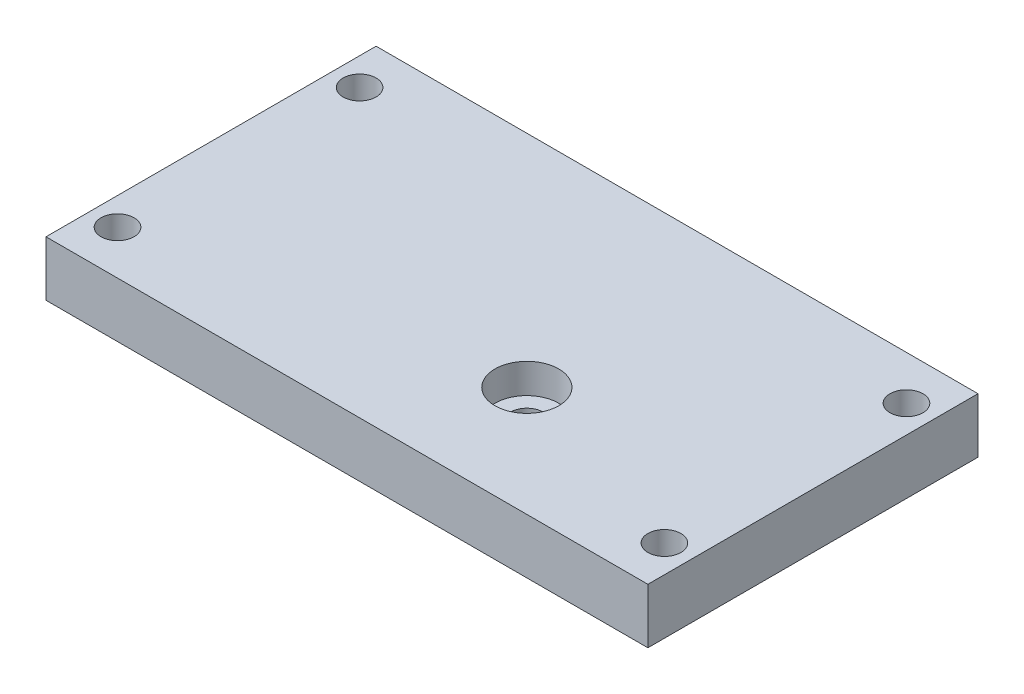
ISO-10303-21;
HEADER;
FILE_DESCRIPTION(('STEP AP214'),'2;1');
FILE_NAME('part.step','',(''),(''),'','','');
FILE_SCHEMA(('AUTOMOTIVE_DESIGN { 1 0 10303 214 1 1 1 1 }'));
ENDSEC;
DATA;
#1=APPLICATION_CONTEXT('core data for automotive mechanical design processes');
#2=APPLICATION_PROTOCOL_DEFINITION('international standard','automotive_design',2000,#1);
#3=PRODUCT_CONTEXT('',#1,'mechanical');
#4=PRODUCT('Part','Part','',(#3));
#5=PRODUCT_RELATED_PRODUCT_CATEGORY('part','',(#4));
#6=PRODUCT_DEFINITION_FORMATION('','',#4);
#7=PRODUCT_DEFINITION_CONTEXT('part definition',#1,'design');
#8=PRODUCT_DEFINITION('design','',#6,#7);
#9=PRODUCT_DEFINITION_SHAPE('','',#8);
#10=(LENGTH_UNIT() NAMED_UNIT(*) SI_UNIT(.MILLI.,.METRE.));
#11=(NAMED_UNIT(*) PLANE_ANGLE_UNIT() SI_UNIT($,.RADIAN.));
#12=(NAMED_UNIT(*) SI_UNIT($,.STERADIAN.) SOLID_ANGLE_UNIT());
#13=UNCERTAINTY_MEASURE_WITH_UNIT(LENGTH_MEASURE(1.E-05),#10,'distance_accuracy_value','');
#14=(GEOMETRIC_REPRESENTATION_CONTEXT(3) GLOBAL_UNCERTAINTY_ASSIGNED_CONTEXT((#13)) GLOBAL_UNIT_ASSIGNED_CONTEXT((#10,
#11,#12)) REPRESENTATION_CONTEXT('',''));
#15=CARTESIAN_POINT('',(0.,0.,0.));
#16=DIRECTION('',(0.,0.,1.));
#17=DIRECTION('',(1.,0.,0.));
#18=AXIS2_PLACEMENT_3D('',#15,#16,#17);
#19=CARTESIAN_POINT('',(-49.7000000000002,5.,-20.));
#20=DIRECTION('',(1.,0.,0.));
#21=DIRECTION('',(0.,0.,-1.));
#22=AXIS2_PLACEMENT_3D('',#19,#20,#21);
#23=PLANE('',#22);
#24=DIRECTION('',(0.,0.,1.));
#25=VECTOR('',#24,1.);
#26=CARTESIAN_POINT('',(-49.7000000000002,0.,-20.));
#27=LINE('',#26,#25);
#28=CARTESIAN_POINT('',(-49.7000000000002,0.,-20.));
#29=VERTEX_POINT('',#28);
#30=CARTESIAN_POINT('',(-49.7000000000002,0.,10.));
#31=VERTEX_POINT('',#30);
#32=EDGE_CURVE('E95',#29,#31,#27,.T.);
#33=ORIENTED_EDGE('',*,*,#32,.T.);
#34=DIRECTION('',(0.,-1.,0.));
#35=VECTOR('',#34,1.);
#36=CARTESIAN_POINT('',(-49.7000000000002,5.,10.));
#37=LINE('',#36,#35);
#38=CARTESIAN_POINT('',(-49.7000000000002,5.,10.));
#39=VERTEX_POINT('',#38);
#40=EDGE_CURVE('E11',#39,#31,#37,.T.);
#41=ORIENTED_EDGE('',*,*,#40,.F.);
#42=DIRECTION('',(0.,0.,1.));
#43=VECTOR('',#42,1.);
#44=CARTESIAN_POINT('',(-49.7000000000002,5.,-20.));
#45=LINE('',#44,#43);
#46=CARTESIAN_POINT('',(-49.7000000000002,5.,-20.));
#47=VERTEX_POINT('',#46);
#48=EDGE_CURVE('E82',#47,#39,#45,.T.);
#49=ORIENTED_EDGE('',*,*,#48,.F.);
#50=DIRECTION('',(0.,-1.,0.));
#51=VECTOR('',#50,1.);
#52=CARTESIAN_POINT('',(-49.7000000000002,5.,-20.));
#53=LINE('',#52,#51);
#54=EDGE_CURVE('E91',#47,#29,#53,.T.);
#55=ORIENTED_EDGE('',*,*,#54,.T.);
#56=EDGE_LOOP('',(#33,#41,#49,#55));
#57=FACE_BOUND('',#56,.T.);
#58=ADVANCED_FACE('F30',(#57),#23,.F.);
#59=CARTESIAN_POINT('',(-49.7000000000002,5.,10.));
#60=DIRECTION('',(0.,0.,-1.));
#61=DIRECTION('',(-1.,0.,0.));
#62=AXIS2_PLACEMENT_3D('',#59,#60,#61);
#63=PLANE('',#62);
#64=DIRECTION('',(1.,0.,0.));
#65=VECTOR('',#64,1.);
#66=CARTESIAN_POINT('',(-49.7000000000002,0.,10.));
#67=LINE('',#66,#65);
#68=CARTESIAN_POINT('',(4.99999999999991,0.,10.));
#69=VERTEX_POINT('',#68);
#70=EDGE_CURVE('E86',#31,#69,#67,.T.);
#71=ORIENTED_EDGE('',*,*,#70,.T.);
#72=DIRECTION('',(0.,-1.,0.));
#73=VECTOR('',#72,1.);
#74=CARTESIAN_POINT('',(4.99999999999991,5.,10.));
#75=LINE('',#74,#73);
#76=CARTESIAN_POINT('',(4.99999999999991,5.,10.));
#77=VERTEX_POINT('',#76);
#78=EDGE_CURVE('E39',#77,#69,#75,.T.);
#79=ORIENTED_EDGE('',*,*,#78,.F.);
#80=DIRECTION('',(1.,0.,0.));
#81=VECTOR('',#80,1.);
#82=CARTESIAN_POINT('',(-49.7000000000002,5.,10.));
#83=LINE('',#82,#81);
#84=EDGE_CURVE('E77',#39,#77,#83,.T.);
#85=ORIENTED_EDGE('',*,*,#84,.F.);
#86=ORIENTED_EDGE('',*,*,#40,.T.);
#87=EDGE_LOOP('',(#71,#79,#85,#86));
#88=FACE_BOUND('',#87,.T.);
#89=ADVANCED_FACE('F85',(#88),#63,.F.);
#90=CARTESIAN_POINT('',(4.99999999999991,5.,-20.));
#91=DIRECTION('',(-1.,0.,0.));
#92=DIRECTION('',(0.,0.,1.));
#93=AXIS2_PLACEMENT_3D('',#90,#91,#92);
#94=PLANE('',#93);
#95=DIRECTION('',(0.,0.,-1.));
#96=VECTOR('',#95,1.);
#97=CARTESIAN_POINT('',(4.99999999999991,0.,-20.));
#98=LINE('',#97,#96);
#99=CARTESIAN_POINT('',(4.99999999999991,0.,-20.));
#100=VERTEX_POINT('',#99);
#101=EDGE_CURVE('E64',#69,#100,#98,.T.);
#102=ORIENTED_EDGE('',*,*,#101,.T.);
#103=DIRECTION('',(0.,-1.,0.));
#104=VECTOR('',#103,1.);
#105=CARTESIAN_POINT('',(4.99999999999991,5.,-20.));
#106=LINE('',#105,#104);
#107=CARTESIAN_POINT('',(4.99999999999991,5.,-20.));
#108=VERTEX_POINT('',#107);
#109=EDGE_CURVE('E87',#108,#100,#106,.T.);
#110=ORIENTED_EDGE('',*,*,#109,.F.);
#111=DIRECTION('',(0.,0.,-1.));
#112=VECTOR('',#111,1.);
#113=CARTESIAN_POINT('',(4.99999999999991,5.,-20.));
#114=LINE('',#113,#112);
#115=EDGE_CURVE('E80',#77,#108,#114,.T.);
#116=ORIENTED_EDGE('',*,*,#115,.F.);
#117=ORIENTED_EDGE('',*,*,#78,.T.);
#118=EDGE_LOOP('',(#102,#110,#116,#117));
#119=FACE_BOUND('',#118,.T.);
#120=ADVANCED_FACE('F89',(#119),#94,.F.);
#121=CARTESIAN_POINT('',(-49.7000000000002,5.,-20.));
#122=DIRECTION('',(0.,0.,1.));
#123=DIRECTION('',(1.,0.,0.));
#124=AXIS2_PLACEMENT_3D('',#121,#122,#123);
#125=PLANE('',#124);
#126=DIRECTION('',(-1.,0.,0.));
#127=VECTOR('',#126,1.);
#128=CARTESIAN_POINT('',(-49.7000000000002,0.,-20.));
#129=LINE('',#128,#127);
#130=EDGE_CURVE('E70',#100,#29,#129,.T.);
#131=ORIENTED_EDGE('',*,*,#130,.T.);
#132=ORIENTED_EDGE('',*,*,#54,.F.);
#133=DIRECTION('',(-1.,0.,0.));
#134=VECTOR('',#133,1.);
#135=CARTESIAN_POINT('',(-49.7000000000002,5.,-20.));
#136=LINE('',#135,#134);
#137=EDGE_CURVE('E47',#108,#47,#136,.T.);
#138=ORIENTED_EDGE('',*,*,#137,.F.);
#139=ORIENTED_EDGE('',*,*,#109,.T.);
#140=EDGE_LOOP('',(#131,#132,#138,#139));
#141=FACE_BOUND('',#140,.T.);
#142=ADVANCED_FACE('F103',(#141),#125,.F.);
#143=CARTESIAN_POINT('',(-49.7000000000002,5.,10.));
#144=DIRECTION('',(0.,1.,0.));
#145=DIRECTION('',(0.,0.,1.));
#146=AXIS2_PLACEMENT_3D('',#143,#144,#145);
#147=PLANE('',#146);
#148=CARTESIAN_POINT('',(-47.2000000000002,5.,6.00000000000001));
#149=DIRECTION('',(0.,1.,0.));
#150=DIRECTION('',(0.,0.,1.));
#151=AXIS2_PLACEMENT_3D('',#148,#149,#150);
#152=CIRCLE('',#151,1.5);
#153=CARTESIAN_POINT('',(-47.2000000000002,5.,7.50000000000001));
#154=VERTEX_POINT('',#153);
#155=EDGE_CURVE('E136',#154,#154,#152,.T.);
#156=ORIENTED_EDGE('',*,*,#155,.F.);
#157=EDGE_LOOP('',(#156));
#158=FACE_BOUND('',#157,.T.);
#159=CARTESIAN_POINT('',(-47.2000000000002,5.,-16.));
#160=DIRECTION('',(0.,1.,0.));
#161=DIRECTION('',(0.,0.,1.));
#162=AXIS2_PLACEMENT_3D('',#159,#160,#161);
#163=CIRCLE('',#162,1.5);
#164=CARTESIAN_POINT('',(-47.2000000000002,5.,-14.5));
#165=VERTEX_POINT('',#164);
#166=EDGE_CURVE('E130',#165,#165,#163,.T.);
#167=ORIENTED_EDGE('',*,*,#166,.F.);
#168=EDGE_LOOP('',(#167));
#169=FACE_BOUND('',#168,.T.);
#170=CARTESIAN_POINT('',(2.49999999999991,5.,-16.));
#171=DIRECTION('',(0.,1.,0.));
#172=DIRECTION('',(0.,0.,1.));
#173=AXIS2_PLACEMENT_3D('',#170,#171,#172);
#174=CIRCLE('',#173,1.5);
#175=CARTESIAN_POINT('',(2.49999999999991,5.,-14.5));
#176=VERTEX_POINT('',#175);
#177=EDGE_CURVE('E124',#176,#176,#174,.T.);
#178=ORIENTED_EDGE('',*,*,#177,.F.);
#179=EDGE_LOOP('',(#178));
#180=FACE_BOUND('',#179,.T.);
#181=CARTESIAN_POINT('',(2.49999999999991,5.,6.00000000000001));
#182=DIRECTION('',(0.,1.,0.));
#183=DIRECTION('',(0.,0.,1.));
#184=AXIS2_PLACEMENT_3D('',#181,#182,#183);
#185=CIRCLE('',#184,1.5);
#186=CARTESIAN_POINT('',(2.49999999999991,5.,7.50000000000001));
#187=VERTEX_POINT('',#186);
#188=EDGE_CURVE('E118',#187,#187,#185,.T.);
#189=ORIENTED_EDGE('',*,*,#188,.F.);
#190=EDGE_LOOP('',(#189));
#191=FACE_BOUND('',#190,.T.);
#192=CARTESIAN_POINT('',(-16.0000000000024,5.0000000000001,-1.88038431709587E-12));
#193=DIRECTION('',(0.,-1.,0.));
#194=DIRECTION('',(1.,0.,0.));
#195=AXIS2_PLACEMENT_3D('',#192,#193,#194);
#196=CIRCLE('',#195,2.90000000000272);
#197=CARTESIAN_POINT('',(-13.0999999999997,5.00000000000009,-1.88038431709587E-12));
#198=VERTEX_POINT('',#197);
#199=EDGE_CURVE('E114',#198,#198,#196,.T.);
#200=ORIENTED_EDGE('',*,*,#199,.T.);
#201=EDGE_LOOP('',(#200));
#202=FACE_BOUND('',#201,.T.);
#203=ORIENTED_EDGE('',*,*,#48,.T.);
#204=ORIENTED_EDGE('',*,*,#84,.T.);
#205=ORIENTED_EDGE('',*,*,#115,.T.);
#206=ORIENTED_EDGE('',*,*,#137,.T.);
#207=EDGE_LOOP('',(#203,#204,#205,#206));
#208=FACE_BOUND('',#207,.T.);
#209=ADVANCED_FACE('F78',(#158,#169,#180,#191,#202,#208),#147,.T.);
#210=CARTESIAN_POINT('',(-49.7000000000002,0.,10.));
#211=DIRECTION('',(0.,1.,0.));
#212=DIRECTION('',(0.,0.,1.));
#213=AXIS2_PLACEMENT_3D('',#210,#211,#212);
#214=PLANE('',#213);
#215=CARTESIAN_POINT('',(-47.2000000000002,0.,6.00000000000001));
#216=DIRECTION('',(0.,1.,0.));
#217=DIRECTION('',(0.,0.,1.));
#218=AXIS2_PLACEMENT_3D('',#215,#216,#217);
#219=CIRCLE('',#218,1.5);
#220=CARTESIAN_POINT('',(-47.2000000000002,0.,7.50000000000001));
#221=VERTEX_POINT('',#220);
#222=EDGE_CURVE('E133',#221,#221,#219,.T.);
#223=ORIENTED_EDGE('',*,*,#222,.T.);
#224=EDGE_LOOP('',(#223));
#225=FACE_BOUND('',#224,.T.);
#226=CARTESIAN_POINT('',(-47.2000000000002,0.,-16.));
#227=DIRECTION('',(0.,1.,0.));
#228=DIRECTION('',(0.,0.,1.));
#229=AXIS2_PLACEMENT_3D('',#226,#227,#228);
#230=CIRCLE('',#229,1.5);
#231=CARTESIAN_POINT('',(-47.2000000000002,0.,-14.5));
#232=VERTEX_POINT('',#231);
#233=EDGE_CURVE('E127',#232,#232,#230,.T.);
#234=ORIENTED_EDGE('',*,*,#233,.T.);
#235=EDGE_LOOP('',(#234));
#236=FACE_BOUND('',#235,.T.);
#237=CARTESIAN_POINT('',(2.49999999999991,0.,-16.));
#238=DIRECTION('',(0.,1.,0.));
#239=DIRECTION('',(0.,0.,1.));
#240=AXIS2_PLACEMENT_3D('',#237,#238,#239);
#241=CIRCLE('',#240,1.5);
#242=CARTESIAN_POINT('',(2.49999999999991,0.,-14.5));
#243=VERTEX_POINT('',#242);
#244=EDGE_CURVE('E121',#243,#243,#241,.T.);
#245=ORIENTED_EDGE('',*,*,#244,.T.);
#246=EDGE_LOOP('',(#245));
#247=FACE_BOUND('',#246,.T.);
#248=CARTESIAN_POINT('',(2.49999999999991,0.,6.00000000000001));
#249=DIRECTION('',(0.,1.,0.));
#250=DIRECTION('',(0.,0.,1.));
#251=AXIS2_PLACEMENT_3D('',#248,#249,#250);
#252=CIRCLE('',#251,1.5);
#253=CARTESIAN_POINT('',(2.49999999999991,0.,7.50000000000001));
#254=VERTEX_POINT('',#253);
#255=EDGE_CURVE('E115',#254,#254,#252,.T.);
#256=ORIENTED_EDGE('',*,*,#255,.T.);
#257=EDGE_LOOP('',(#256));
#258=FACE_BOUND('',#257,.T.);
#259=CARTESIAN_POINT('',(-16.0000000000001,0.,0.));
#260=DIRECTION('',(0.,1.,0.));
#261=DIRECTION('',(0.,0.,1.));
#262=AXIS2_PLACEMENT_3D('',#259,#260,#261);
#263=CIRCLE('',#262,1.5);
#264=CARTESIAN_POINT('',(-16.0000000000001,0.,1.50000000000001));
#265=VERTEX_POINT('',#264);
#266=EDGE_CURVE('E98',#265,#265,#263,.T.);
#267=ORIENTED_EDGE('',*,*,#266,.T.);
#268=EDGE_LOOP('',(#267));
#269=FACE_BOUND('',#268,.T.);
#270=ORIENTED_EDGE('',*,*,#32,.F.);
#271=ORIENTED_EDGE('',*,*,#130,.F.);
#272=ORIENTED_EDGE('',*,*,#101,.F.);
#273=ORIENTED_EDGE('',*,*,#70,.F.);
#274=EDGE_LOOP('',(#270,#271,#272,#273));
#275=FACE_BOUND('',#274,.T.);
#276=ADVANCED_FACE('F106',(#225,#236,#247,#258,#269,#275),#214,.F.);
#277=CARTESIAN_POINT('',(-16.0000000000001,0.,0.));
#278=DIRECTION('',(0.,1.,0.));
#279=DIRECTION('',(0.,0.,1.));
#280=AXIS2_PLACEMENT_3D('',#277,#278,#279);
#281=CYLINDRICAL_SURFACE('',#280,1.5);
#282=CARTESIAN_POINT('',(-16.0000000000001,2.29999999999859,0.));
#283=DIRECTION('',(0.,-1.,0.));
#284=DIRECTION('',(1.,0.,0.));
#285=AXIS2_PLACEMENT_3D('',#282,#283,#284);
#286=CIRCLE('',#285,1.5);
#287=CARTESIAN_POINT('',(-14.5000000000001,2.29999999999858,0.));
#288=VERTEX_POINT('',#287);
#289=EDGE_CURVE('E33',#288,#288,#286,.F.);
#290=ORIENTED_EDGE('',*,*,#289,.T.);
#291=EDGE_LOOP('',(#290));
#292=FACE_BOUND('',#291,.T.);
#293=ORIENTED_EDGE('',*,*,#266,.F.);
#294=EDGE_LOOP('',(#293));
#295=FACE_BOUND('',#294,.T.);
#296=ADVANCED_FACE('F172',(#292,#295),#281,.F.);
#297=CARTESIAN_POINT('',(-16.0000000000024,2.29999999999859,-1.87989767891954E-12));
#298=DIRECTION('',(0.,-1.,0.));
#299=DIRECTION('',(1.,0.,0.));
#300=AXIS2_PLACEMENT_3D('',#297,#298,#299);
#301=PLANE('',#300);
#302=CARTESIAN_POINT('',(-16.0000000000024,2.29999999999859,-1.87989767891954E-12));
#303=DIRECTION('',(0.,-1.,0.));
#304=DIRECTION('',(1.,0.,0.));
#305=AXIS2_PLACEMENT_3D('',#302,#303,#304);
#306=CIRCLE('',#305,2.90000000000272);
#307=CARTESIAN_POINT('',(-13.0999999999997,2.29999999999857,-1.87989767891954E-12));
#308=VERTEX_POINT('',#307);
#309=EDGE_CURVE('E111',#308,#308,#306,.T.);
#310=ORIENTED_EDGE('',*,*,#309,.F.);
#311=EDGE_LOOP('',(#310));
#312=FACE_BOUND('',#311,.T.);
#313=ORIENTED_EDGE('',*,*,#289,.F.);
#314=EDGE_LOOP('',(#313));
#315=FACE_BOUND('',#314,.T.);
#316=ADVANCED_FACE('F166',(#312,#315),#301,.F.);
#317=CARTESIAN_POINT('',(-16.0000000000024,5.0000000000001,-1.88038431709587E-12));
#318=DIRECTION('',(0.,-1.,0.));
#319=DIRECTION('',(1.,0.,0.));
#320=AXIS2_PLACEMENT_3D('',#317,#318,#319);
#321=CYLINDRICAL_SURFACE('',#320,2.90000000000272);
#322=ORIENTED_EDGE('',*,*,#199,.F.);
#323=EDGE_LOOP('',(#322));
#324=FACE_BOUND('',#323,.T.);
#325=ORIENTED_EDGE('',*,*,#309,.T.);
#326=EDGE_LOOP('',(#325));
#327=FACE_BOUND('',#326,.T.);
#328=ADVANCED_FACE('F162',(#324,#327),#321,.F.);
#329=CARTESIAN_POINT('',(2.49999999999991,0.,6.00000000000001));
#330=DIRECTION('',(0.,1.,0.));
#331=DIRECTION('',(0.,0.,1.));
#332=AXIS2_PLACEMENT_3D('',#329,#330,#331);
#333=CYLINDRICAL_SURFACE('',#332,1.5);
#334=ORIENTED_EDGE('',*,*,#255,.F.);
#335=EDGE_LOOP('',(#334));
#336=FACE_BOUND('',#335,.T.);
#337=ORIENTED_EDGE('',*,*,#188,.T.);
#338=EDGE_LOOP('',(#337));
#339=FACE_BOUND('',#338,.T.);
#340=ADVANCED_FACE('F165',(#336,#339),#333,.F.);
#341=CARTESIAN_POINT('',(2.49999999999991,0.,-16.));
#342=DIRECTION('',(0.,1.,0.));
#343=DIRECTION('',(0.,0.,1.));
#344=AXIS2_PLACEMENT_3D('',#341,#342,#343);
#345=CYLINDRICAL_SURFACE('',#344,1.5);
#346=ORIENTED_EDGE('',*,*,#244,.F.);
#347=EDGE_LOOP('',(#346));
#348=FACE_BOUND('',#347,.T.);
#349=ORIENTED_EDGE('',*,*,#177,.T.);
#350=EDGE_LOOP('',(#349));
#351=FACE_BOUND('',#350,.T.);
#352=ADVANCED_FACE('F223',(#348,#351),#345,.F.);
#353=CARTESIAN_POINT('',(-47.2000000000002,0.,-16.));
#354=DIRECTION('',(0.,1.,0.));
#355=DIRECTION('',(0.,0.,1.));
#356=AXIS2_PLACEMENT_3D('',#353,#354,#355);
#357=CYLINDRICAL_SURFACE('',#356,1.5);
#358=ORIENTED_EDGE('',*,*,#233,.F.);
#359=EDGE_LOOP('',(#358));
#360=FACE_BOUND('',#359,.T.);
#361=ORIENTED_EDGE('',*,*,#166,.T.);
#362=EDGE_LOOP('',(#361));
#363=FACE_BOUND('',#362,.T.);
#364=ADVANCED_FACE('F147',(#360,#363),#357,.F.);
#365=CARTESIAN_POINT('',(-47.2000000000002,0.,6.00000000000001));
#366=DIRECTION('',(0.,1.,0.));
#367=DIRECTION('',(0.,0.,1.));
#368=AXIS2_PLACEMENT_3D('',#365,#366,#367);
#369=CYLINDRICAL_SURFACE('',#368,1.5);
#370=ORIENTED_EDGE('',*,*,#222,.F.);
#371=EDGE_LOOP('',(#370));
#372=FACE_BOUND('',#371,.T.);
#373=ORIENTED_EDGE('',*,*,#155,.T.);
#374=EDGE_LOOP('',(#373));
#375=FACE_BOUND('',#374,.T.);
#376=ADVANCED_FACE('F144',(#372,#375),#369,.F.);
#377=CLOSED_SHELL('',(#58,#89,#120,#142,#209,#276,#296,#316,#328,#340,#352,#364,#376));
#378=MANIFOLD_SOLID_BREP('B2',#377);
#379=ADVANCED_BREP_SHAPE_REPRESENTATION('',(#18,#378),#14);
#380=SHAPE_DEFINITION_REPRESENTATION(#9,#379);
ENDSEC;
END-ISO-10303-21;
